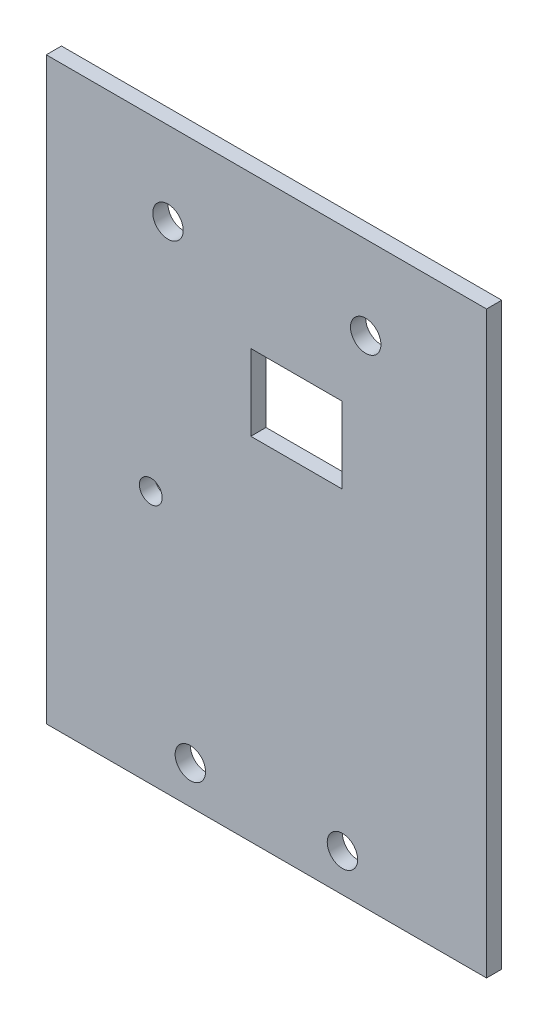
ISO-10303-21;
HEADER;
FILE_DESCRIPTION(('STEP AP214'),'2;1');
FILE_NAME('part.step','',(''),(''),'','','');
FILE_SCHEMA(('AUTOMOTIVE_DESIGN { 1 0 10303 214 1 1 1 1 }'));
ENDSEC;
DATA;
#1=APPLICATION_CONTEXT('core data for automotive mechanical design processes');
#2=APPLICATION_PROTOCOL_DEFINITION('international standard','automotive_design',2000,#1);
#3=PRODUCT_CONTEXT('',#1,'mechanical');
#4=PRODUCT('Part','Part','',(#3));
#5=PRODUCT_RELATED_PRODUCT_CATEGORY('part','',(#4));
#6=PRODUCT_DEFINITION_FORMATION('','',#4);
#7=PRODUCT_DEFINITION_CONTEXT('part definition',#1,'design');
#8=PRODUCT_DEFINITION('design','',#6,#7);
#9=PRODUCT_DEFINITION_SHAPE('','',#8);
#10=(LENGTH_UNIT() NAMED_UNIT(*) SI_UNIT(.MILLI.,.METRE.));
#11=(NAMED_UNIT(*) PLANE_ANGLE_UNIT() SI_UNIT($,.RADIAN.));
#12=(NAMED_UNIT(*) SI_UNIT($,.STERADIAN.) SOLID_ANGLE_UNIT());
#13=UNCERTAINTY_MEASURE_WITH_UNIT(LENGTH_MEASURE(1.E-05),#10,'distance_accuracy_value','');
#14=(GEOMETRIC_REPRESENTATION_CONTEXT(3) GLOBAL_UNCERTAINTY_ASSIGNED_CONTEXT((#13)) GLOBAL_UNIT_ASSIGNED_CONTEXT((#10,
#11,#12)) REPRESENTATION_CONTEXT('',''));
#15=CARTESIAN_POINT('',(0.,0.,0.));
#16=DIRECTION('',(0.,0.,1.));
#17=DIRECTION('',(1.,0.,0.));
#18=AXIS2_PLACEMENT_3D('',#15,#16,#17);
#19=CARTESIAN_POINT('',(-35.5403922344283,29.2034183120229,2.));
#20=DIRECTION('',(1.,0.,0.));
#21=DIRECTION('',(0.,0.,-1.));
#22=AXIS2_PLACEMENT_3D('',#19,#20,#21);
#23=PLANE('',#22);
#24=DIRECTION('',(0.,-1.,0.));
#25=VECTOR('',#24,1.);
#26=CARTESIAN_POINT('',(-35.5403922344283,29.2034183120229,-8.));
#27=LINE('',#26,#25);
#28=CARTESIAN_POINT('',(-35.5403922344283,29.2034183120229,-8.));
#29=VERTEX_POINT('',#28);
#30=CARTESIAN_POINT('',(-35.5403922344283,-46.9965816879772,-8.));
#31=VERTEX_POINT('',#30);
#32=EDGE_CURVE('E114',#29,#31,#27,.T.);
#33=ORIENTED_EDGE('',*,*,#32,.F.);
#34=DIRECTION('',(0.,0.,-1.));
#35=VECTOR('',#34,1.);
#36=CARTESIAN_POINT('',(-35.5403922344283,29.2034183120229,2.));
#37=LINE('',#36,#35);
#38=CARTESIAN_POINT('',(-35.5403922344283,29.2034183120229,-10.));
#39=VERTEX_POINT('',#38);
#40=EDGE_CURVE('E133',#29,#39,#37,.T.);
#41=ORIENTED_EDGE('',*,*,#40,.T.);
#42=DIRECTION('',(0.,1.,0.));
#43=VECTOR('',#42,1.);
#44=CARTESIAN_POINT('',(-35.5403922344283,0.,-10.));
#45=LINE('',#44,#43);
#46=CARTESIAN_POINT('',(-35.5403922344283,-46.9965816879772,-10.));
#47=VERTEX_POINT('',#46);
#48=EDGE_CURVE('E131',#47,#39,#45,.T.);
#49=ORIENTED_EDGE('',*,*,#48,.F.);
#50=DIRECTION('',(0.,0.,-1.));
#51=VECTOR('',#50,1.);
#52=CARTESIAN_POINT('',(-35.5403922344283,-46.9965816879772,2.));
#53=LINE('',#52,#51);
#54=EDGE_CURVE('E12',#31,#47,#53,.T.);
#55=ORIENTED_EDGE('',*,*,#54,.F.);
#56=EDGE_LOOP('',(#33,#41,#49,#55));
#57=FACE_BOUND('',#56,.T.);
#58=ADVANCED_FACE('F52',(#57),#23,.F.);
#59=CARTESIAN_POINT('',(-35.5403922344283,-46.9965816879772,2.));
#60=DIRECTION('',(0.,1.,0.));
#61=DIRECTION('',(0.,0.,1.));
#62=AXIS2_PLACEMENT_3D('',#59,#60,#61);
#63=PLANE('',#62);
#64=DIRECTION('',(1.,0.,0.));
#65=VECTOR('',#64,1.);
#66=CARTESIAN_POINT('',(-35.5403922344283,-46.9965816879772,-8.));
#67=LINE('',#66,#65);
#68=CARTESIAN_POINT('',(22.3596077655717,-46.9965816879772,-8.));
#69=VERTEX_POINT('',#68);
#70=EDGE_CURVE('E118',#31,#69,#67,.T.);
#71=ORIENTED_EDGE('',*,*,#70,.F.);
#72=ORIENTED_EDGE('',*,*,#54,.T.);
#73=DIRECTION('',(-1.,0.,0.));
#74=VECTOR('',#73,1.);
#75=CARTESIAN_POINT('',(0.,-46.9965816879772,-10.));
#76=LINE('',#75,#74);
#77=CARTESIAN_POINT('',(22.3596077655717,-46.9965816879772,-10.));
#78=VERTEX_POINT('',#77);
#79=EDGE_CURVE('E138',#78,#47,#76,.T.);
#80=ORIENTED_EDGE('',*,*,#79,.F.);
#81=DIRECTION('',(0.,0.,-1.));
#82=VECTOR('',#81,1.);
#83=CARTESIAN_POINT('',(22.3596077655717,-46.9965816879772,2.));
#84=LINE('',#83,#82);
#85=EDGE_CURVE('E60',#69,#78,#84,.T.);
#86=ORIENTED_EDGE('',*,*,#85,.F.);
#87=EDGE_LOOP('',(#71,#72,#80,#86));
#88=FACE_BOUND('',#87,.T.);
#89=ADVANCED_FACE('F126',(#88),#63,.F.);
#90=CARTESIAN_POINT('',(22.3596077655717,29.2034183120229,2.));
#91=DIRECTION('',(-1.,0.,0.));
#92=DIRECTION('',(0.,-1.,0.));
#93=AXIS2_PLACEMENT_3D('',#90,#91,#92);
#94=PLANE('',#93);
#95=DIRECTION('',(0.,1.,0.));
#96=VECTOR('',#95,1.);
#97=CARTESIAN_POINT('',(22.3596077655717,29.2034183120229,-8.));
#98=LINE('',#97,#96);
#99=CARTESIAN_POINT('',(22.3596077655717,29.2034183120229,-8.));
#100=VERTEX_POINT('',#99);
#101=EDGE_CURVE('E67',#69,#100,#98,.T.);
#102=ORIENTED_EDGE('',*,*,#101,.F.);
#103=ORIENTED_EDGE('',*,*,#85,.T.);
#104=DIRECTION('',(0.,-1.,0.));
#105=VECTOR('',#104,1.);
#106=CARTESIAN_POINT('',(22.3596077655717,0.,-10.));
#107=LINE('',#106,#105);
#108=CARTESIAN_POINT('',(22.3596077655717,29.2034183120229,-10.));
#109=VERTEX_POINT('',#108);
#110=EDGE_CURVE('E144',#109,#78,#107,.T.);
#111=ORIENTED_EDGE('',*,*,#110,.F.);
#112=DIRECTION('',(0.,0.,-1.));
#113=VECTOR('',#112,1.);
#114=CARTESIAN_POINT('',(22.3596077655717,29.2034183120229,2.));
#115=LINE('',#114,#113);
#116=EDGE_CURVE('E175',#100,#109,#115,.T.);
#117=ORIENTED_EDGE('',*,*,#116,.F.);
#118=EDGE_LOOP('',(#102,#103,#111,#117));
#119=FACE_BOUND('',#118,.T.);
#120=ADVANCED_FACE('F178',(#119),#94,.F.);
#121=CARTESIAN_POINT('',(-35.5403922344283,29.2034183120229,2.));
#122=DIRECTION('',(0.,-1.,0.));
#123=DIRECTION('',(0.,0.,-1.));
#124=AXIS2_PLACEMENT_3D('',#121,#122,#123);
#125=PLANE('',#124);
#126=DIRECTION('',(-1.,0.,0.));
#127=VECTOR('',#126,1.);
#128=CARTESIAN_POINT('',(-35.5403922344283,29.2034183120229,-8.));
#129=LINE('',#128,#127);
#130=EDGE_CURVE('E119',#100,#29,#129,.T.);
#131=ORIENTED_EDGE('',*,*,#130,.F.);
#132=ORIENTED_EDGE('',*,*,#116,.T.);
#133=DIRECTION('',(1.,0.,0.));
#134=VECTOR('',#133,1.);
#135=CARTESIAN_POINT('',(0.,29.2034183120229,-10.));
#136=LINE('',#135,#134);
#137=EDGE_CURVE('E137',#39,#109,#136,.T.);
#138=ORIENTED_EDGE('',*,*,#137,.F.);
#139=ORIENTED_EDGE('',*,*,#40,.F.);
#140=EDGE_LOOP('',(#131,#132,#138,#139));
#141=FACE_BOUND('',#140,.T.);
#142=ADVANCED_FACE('F232',(#141),#125,.F.);
#143=CARTESIAN_POINT('',(-16.5903922344283,-41.9965816879772,17.6204993518133));
#144=DIRECTION('',(0.,0.,-1.));
#145=DIRECTION('',(-1.,0.,0.));
#146=AXIS2_PLACEMENT_3D('',#143,#144,#145);
#147=CYLINDRICAL_SURFACE('',#146,2.);
#148=CARTESIAN_POINT('',(-16.5903922344283,-41.9965816879772,-10.));
#149=DIRECTION('',(0.,0.,-1.));
#150=DIRECTION('',(-1.,0.,0.));
#151=AXIS2_PLACEMENT_3D('',#148,#149,#150);
#152=CIRCLE('',#151,2.);
#153=CARTESIAN_POINT('',(-18.5903922344283,-41.9965816879772,-10.));
#154=VERTEX_POINT('',#153);
#155=EDGE_CURVE('E206',#154,#154,#152,.F.);
#156=ORIENTED_EDGE('',*,*,#155,.F.);
#157=EDGE_LOOP('',(#156));
#158=FACE_BOUND('',#157,.T.);
#159=CARTESIAN_POINT('',(-16.5903922344283,-41.9965816879772,-8.));
#160=DIRECTION('',(0.,0.,1.));
#161=DIRECTION('',(1.,0.,0.));
#162=AXIS2_PLACEMENT_3D('',#159,#160,#161);
#163=CIRCLE('',#162,2.);
#164=CARTESIAN_POINT('',(-14.5903922344283,-41.9965816879772,-8.));
#165=VERTEX_POINT('',#164);
#166=EDGE_CURVE('E199',#165,#165,#163,.F.);
#167=ORIENTED_EDGE('',*,*,#166,.F.);
#168=EDGE_LOOP('',(#167));
#169=FACE_BOUND('',#168,.T.);
#170=ADVANCED_FACE('F230',(#158,#169),#147,.F.);
#171=CARTESIAN_POINT('',(3.40960776557173,-41.9965816879772,17.6204993518133));
#172=DIRECTION('',(0.,0.,-1.));
#173=DIRECTION('',(-1.,0.,0.));
#174=AXIS2_PLACEMENT_3D('',#171,#172,#173);
#175=CYLINDRICAL_SURFACE('',#174,2.);
#176=CARTESIAN_POINT('',(3.40960776557173,-41.9965816879772,-10.));
#177=DIRECTION('',(0.,0.,-1.));
#178=DIRECTION('',(-1.,0.,0.));
#179=AXIS2_PLACEMENT_3D('',#176,#177,#178);
#180=CIRCLE('',#179,2.);
#181=CARTESIAN_POINT('',(1.40960776557173,-41.9965816879772,-10.));
#182=VERTEX_POINT('',#181);
#183=EDGE_CURVE('E145',#182,#182,#180,.F.);
#184=ORIENTED_EDGE('',*,*,#183,.F.);
#185=EDGE_LOOP('',(#184));
#186=FACE_BOUND('',#185,.T.);
#187=CARTESIAN_POINT('',(3.40960776557173,-41.9965816879772,-8.));
#188=DIRECTION('',(0.,0.,1.));
#189=DIRECTION('',(1.,0.,0.));
#190=AXIS2_PLACEMENT_3D('',#187,#188,#189);
#191=CIRCLE('',#190,2.);
#192=CARTESIAN_POINT('',(5.40960776557173,-41.9965816879772,-8.));
#193=VERTEX_POINT('',#192);
#194=EDGE_CURVE('E196',#193,#193,#191,.F.);
#195=ORIENTED_EDGE('',*,*,#194,.F.);
#196=EDGE_LOOP('',(#195));
#197=FACE_BOUND('',#196,.T.);
#198=ADVANCED_FACE('F219',(#186,#197),#175,.F.);
#199=CARTESIAN_POINT('',(-21.7903922344283,-13.6265816879771,17.6204993518133));
#200=DIRECTION('',(0.,0.,-1.));
#201=DIRECTION('',(-1.,0.,0.));
#202=AXIS2_PLACEMENT_3D('',#199,#200,#201);
#203=CYLINDRICAL_SURFACE('',#202,1.5);
#204=CARTESIAN_POINT('',(-21.7903922344283,-13.6265816879771,-10.));
#205=DIRECTION('',(0.,0.,-1.));
#206=DIRECTION('',(-1.,0.,0.));
#207=AXIS2_PLACEMENT_3D('',#204,#205,#206);
#208=CIRCLE('',#207,1.5);
#209=CARTESIAN_POINT('',(-23.2903922344283,-13.6265816879771,-10.));
#210=VERTEX_POINT('',#209);
#211=EDGE_CURVE('E148',#210,#210,#208,.F.);
#212=ORIENTED_EDGE('',*,*,#211,.F.);
#213=EDGE_LOOP('',(#212));
#214=FACE_BOUND('',#213,.T.);
#215=CARTESIAN_POINT('',(-21.7903922344283,-13.6265816879771,-8.));
#216=DIRECTION('',(0.,0.,1.));
#217=DIRECTION('',(1.,0.,0.));
#218=AXIS2_PLACEMENT_3D('',#215,#216,#217);
#219=CIRCLE('',#218,1.5);
#220=CARTESIAN_POINT('',(-20.2903922344283,-13.6265816879771,-8.));
#221=VERTEX_POINT('',#220);
#222=EDGE_CURVE('E193',#221,#221,#219,.F.);
#223=ORIENTED_EDGE('',*,*,#222,.F.);
#224=EDGE_LOOP('',(#223));
#225=FACE_BOUND('',#224,.T.);
#226=ADVANCED_FACE('F215',(#214,#225),#203,.F.);
#227=CARTESIAN_POINT('',(0.,-0.796581687977154,17.6204993518133));
#228=DIRECTION('',(0.,1.,0.));
#229=DIRECTION('',(0.,0.,1.));
#230=AXIS2_PLACEMENT_3D('',#227,#228,#229);
#231=PLANE('',#230);
#232=DIRECTION('',(0.,0.,-1.));
#233=VECTOR('',#232,1.);
#234=CARTESIAN_POINT('',(-8.64039223442828,-0.796581687977154,17.6204993518133));
#235=LINE('',#234,#233);
#236=CARTESIAN_POINT('',(-8.64039223442828,-0.796581687977154,-8.));
#237=VERTEX_POINT('',#236);
#238=CARTESIAN_POINT('',(-8.64039223442828,-0.796581687977154,-10.));
#239=VERTEX_POINT('',#238);
#240=EDGE_CURVE('E166',#237,#239,#235,.T.);
#241=ORIENTED_EDGE('',*,*,#240,.F.);
#242=DIRECTION('',(1.,0.,0.));
#243=VECTOR('',#242,1.);
#244=CARTESIAN_POINT('',(0.,-0.796581687977154,-8.));
#245=LINE('',#244,#243);
#246=CARTESIAN_POINT('',(3.35960776557172,-0.796581687977154,-8.));
#247=VERTEX_POINT('',#246);
#248=EDGE_CURVE('E75',#237,#247,#245,.T.);
#249=ORIENTED_EDGE('',*,*,#248,.T.);
#250=DIRECTION('',(0.,0.,-1.));
#251=VECTOR('',#250,1.);
#252=CARTESIAN_POINT('',(3.35960776557172,-0.796581687977154,17.6204993518133));
#253=LINE('',#252,#251);
#254=CARTESIAN_POINT('',(3.35960776557172,-0.796581687977154,-10.));
#255=VERTEX_POINT('',#254);
#256=EDGE_CURVE('E167',#247,#255,#253,.T.);
#257=ORIENTED_EDGE('',*,*,#256,.T.);
#258=DIRECTION('',(1.,0.,0.));
#259=VECTOR('',#258,1.);
#260=CARTESIAN_POINT('',(0.,-0.796581687977154,-10.));
#261=LINE('',#260,#259);
#262=EDGE_CURVE('E163',#239,#255,#261,.T.);
#263=ORIENTED_EDGE('',*,*,#262,.F.);
#264=EDGE_LOOP('',(#241,#249,#257,#263));
#265=FACE_BOUND('',#264,.T.);
#266=ADVANCED_FACE('F218',(#265),#231,.T.);
#267=CARTESIAN_POINT('',(3.35960776557172,0.,17.6204993518133));
#268=DIRECTION('',(1.,0.,0.));
#269=DIRECTION('',(0.,0.,-1.));
#270=AXIS2_PLACEMENT_3D('',#267,#268,#269);
#271=PLANE('',#270);
#272=DIRECTION('',(0.,-1.,0.));
#273=VECTOR('',#272,1.);
#274=CARTESIAN_POINT('',(3.35960776557172,0.,-8.));
#275=LINE('',#274,#273);
#276=CARTESIAN_POINT('',(3.35960776557172,9.20341831202285,-8.));
#277=VERTEX_POINT('',#276);
#278=EDGE_CURVE('E190',#277,#247,#275,.T.);
#279=ORIENTED_EDGE('',*,*,#278,.F.);
#280=DIRECTION('',(0.,0.,-1.));
#281=VECTOR('',#280,1.);
#282=CARTESIAN_POINT('',(3.35960776557172,9.20341831202285,17.6204993518133));
#283=LINE('',#282,#281);
#284=CARTESIAN_POINT('',(3.35960776557172,9.20341831202285,-10.));
#285=VERTEX_POINT('',#284);
#286=EDGE_CURVE('E169',#277,#285,#283,.T.);
#287=ORIENTED_EDGE('',*,*,#286,.T.);
#288=DIRECTION('',(0.,1.,0.));
#289=VECTOR('',#288,1.);
#290=CARTESIAN_POINT('',(3.35960776557172,0.,-10.));
#291=LINE('',#290,#289);
#292=EDGE_CURVE('E154',#255,#285,#291,.T.);
#293=ORIENTED_EDGE('',*,*,#292,.F.);
#294=ORIENTED_EDGE('',*,*,#256,.F.);
#295=EDGE_LOOP('',(#279,#287,#293,#294));
#296=FACE_BOUND('',#295,.T.);
#297=ADVANCED_FACE('F257',(#296),#271,.F.);
#298=CARTESIAN_POINT('',(0.,9.20341831202285,17.6204993518133));
#299=DIRECTION('',(0.,1.,0.));
#300=DIRECTION('',(0.,0.,1.));
#301=AXIS2_PLACEMENT_3D('',#298,#299,#300);
#302=PLANE('',#301);
#303=DIRECTION('',(1.,0.,0.));
#304=VECTOR('',#303,1.);
#305=CARTESIAN_POINT('',(0.,9.20341831202285,-8.));
#306=LINE('',#305,#304);
#307=CARTESIAN_POINT('',(-8.64039223442828,9.20341831202285,-8.));
#308=VERTEX_POINT('',#307);
#309=EDGE_CURVE('E188',#308,#277,#306,.T.);
#310=ORIENTED_EDGE('',*,*,#309,.F.);
#311=DIRECTION('',(0.,0.,-1.));
#312=VECTOR('',#311,1.);
#313=CARTESIAN_POINT('',(-8.64039223442828,9.20341831202285,17.6204993518133));
#314=LINE('',#313,#312);
#315=CARTESIAN_POINT('',(-8.64039223442828,9.20341831202285,-10.));
#316=VERTEX_POINT('',#315);
#317=EDGE_CURVE('E171',#308,#316,#314,.T.);
#318=ORIENTED_EDGE('',*,*,#317,.T.);
#319=DIRECTION('',(-1.,0.,0.));
#320=VECTOR('',#319,1.);
#321=CARTESIAN_POINT('',(0.,9.20341831202285,-10.));
#322=LINE('',#321,#320);
#323=EDGE_CURVE('E157',#285,#316,#322,.T.);
#324=ORIENTED_EDGE('',*,*,#323,.F.);
#325=ORIENTED_EDGE('',*,*,#286,.F.);
#326=EDGE_LOOP('',(#310,#318,#324,#325));
#327=FACE_BOUND('',#326,.T.);
#328=ADVANCED_FACE('F261',(#327),#302,.F.);
#329=CARTESIAN_POINT('',(-8.64039223442828,0.,17.6204993518133));
#330=DIRECTION('',(1.,0.,0.));
#331=DIRECTION('',(0.,0.,-1.));
#332=AXIS2_PLACEMENT_3D('',#329,#330,#331);
#333=PLANE('',#332);
#334=ORIENTED_EDGE('',*,*,#317,.F.);
#335=DIRECTION('',(0.,-1.,0.));
#336=VECTOR('',#335,1.);
#337=CARTESIAN_POINT('',(-8.64039223442828,0.,-8.));
#338=LINE('',#337,#336);
#339=EDGE_CURVE('E186',#308,#237,#338,.T.);
#340=ORIENTED_EDGE('',*,*,#339,.T.);
#341=ORIENTED_EDGE('',*,*,#240,.T.);
#342=DIRECTION('',(0.,-1.,0.));
#343=VECTOR('',#342,1.);
#344=CARTESIAN_POINT('',(-8.64039223442828,0.,-10.));
#345=LINE('',#344,#343);
#346=EDGE_CURVE('E160',#316,#239,#345,.T.);
#347=ORIENTED_EDGE('',*,*,#346,.F.);
#348=EDGE_LOOP('',(#334,#340,#341,#347));
#349=FACE_BOUND('',#348,.T.);
#350=ADVANCED_FACE('F264',(#349),#333,.T.);
#351=CARTESIAN_POINT('',(-19.5318449308341,18.2034183120228,0.));
#352=DIRECTION('',(0.,0.,-1.));
#353=DIRECTION('',(-1.,0.,0.));
#354=AXIS2_PLACEMENT_3D('',#351,#352,#353);
#355=CYLINDRICAL_SURFACE('',#354,2.);
#356=CARTESIAN_POINT('',(-19.5318449308341,18.2034183120228,-10.));
#357=DIRECTION('',(0.,0.,-1.));
#358=DIRECTION('',(-1.,0.,0.));
#359=AXIS2_PLACEMENT_3D('',#356,#357,#358);
#360=CIRCLE('',#359,2.);
#361=CARTESIAN_POINT('',(-21.5318449308341,18.2034183120228,-10.));
#362=VERTEX_POINT('',#361);
#363=EDGE_CURVE('E202',#362,#362,#360,.T.);
#364=ORIENTED_EDGE('',*,*,#363,.T.);
#365=EDGE_LOOP('',(#364));
#366=FACE_BOUND('',#365,.T.);
#367=CARTESIAN_POINT('',(-19.5318449308341,18.2034183120228,-8.));
#368=DIRECTION('',(0.,0.,1.));
#369=DIRECTION('',(1.,0.,0.));
#370=AXIS2_PLACEMENT_3D('',#367,#368,#369);
#371=CIRCLE('',#370,2.);
#372=CARTESIAN_POINT('',(-17.5318449308341,18.2034183120228,-8.));
#373=VERTEX_POINT('',#372);
#374=EDGE_CURVE('E183',#373,#373,#371,.F.);
#375=ORIENTED_EDGE('',*,*,#374,.F.);
#376=EDGE_LOOP('',(#375));
#377=FACE_BOUND('',#376,.T.);
#378=ADVANCED_FACE('F267',(#366,#377),#355,.F.);
#379=CARTESIAN_POINT('',(6.4681550691659,18.2034183120228,0.));
#380=DIRECTION('',(0.,0.,-1.));
#381=DIRECTION('',(-1.,0.,0.));
#382=AXIS2_PLACEMENT_3D('',#379,#380,#381);
#383=CYLINDRICAL_SURFACE('',#382,2.);
#384=CARTESIAN_POINT('',(6.4681550691659,18.2034183120228,-10.));
#385=DIRECTION('',(0.,0.,-1.));
#386=DIRECTION('',(-1.,0.,0.));
#387=AXIS2_PLACEMENT_3D('',#384,#385,#386);
#388=CIRCLE('',#387,2.);
#389=CARTESIAN_POINT('',(4.4681550691659,18.2034183120228,-10.));
#390=VERTEX_POINT('',#389);
#391=EDGE_CURVE('E203',#390,#390,#388,.T.);
#392=ORIENTED_EDGE('',*,*,#391,.T.);
#393=EDGE_LOOP('',(#392));
#394=FACE_BOUND('',#393,.T.);
#395=CARTESIAN_POINT('',(6.4681550691659,18.2034183120228,-8.));
#396=DIRECTION('',(0.,0.,1.));
#397=DIRECTION('',(1.,0.,0.));
#398=AXIS2_PLACEMENT_3D('',#395,#396,#397);
#399=CIRCLE('',#398,2.);
#400=CARTESIAN_POINT('',(8.4681550691659,18.2034183120228,-8.));
#401=VERTEX_POINT('',#400);
#402=EDGE_CURVE('E55',#401,#401,#399,.F.);
#403=ORIENTED_EDGE('',*,*,#402,.F.);
#404=EDGE_LOOP('',(#403));
#405=FACE_BOUND('',#404,.T.);
#406=ADVANCED_FACE('F272',(#394,#405),#383,.F.);
#407=CARTESIAN_POINT('',(0.,0.,-10.));
#408=DIRECTION('',(0.,0.,-1.));
#409=DIRECTION('',(-1.,0.,0.));
#410=AXIS2_PLACEMENT_3D('',#407,#408,#409);
#411=PLANE('',#410);
#412=ORIENTED_EDGE('',*,*,#391,.F.);
#413=EDGE_LOOP('',(#412));
#414=FACE_BOUND('',#413,.T.);
#415=ORIENTED_EDGE('',*,*,#363,.F.);
#416=EDGE_LOOP('',(#415));
#417=FACE_BOUND('',#416,.T.);
#418=ORIENTED_EDGE('',*,*,#155,.T.);
#419=EDGE_LOOP('',(#418));
#420=FACE_BOUND('',#419,.T.);
#421=ORIENTED_EDGE('',*,*,#211,.T.);
#422=EDGE_LOOP('',(#421));
#423=FACE_BOUND('',#422,.T.);
#424=ORIENTED_EDGE('',*,*,#183,.T.);
#425=EDGE_LOOP('',(#424));
#426=FACE_BOUND('',#425,.T.);
#427=ORIENTED_EDGE('',*,*,#79,.T.);
#428=ORIENTED_EDGE('',*,*,#48,.T.);
#429=ORIENTED_EDGE('',*,*,#137,.T.);
#430=ORIENTED_EDGE('',*,*,#110,.T.);
#431=EDGE_LOOP('',(#427,#428,#429,#430));
#432=FACE_BOUND('',#431,.T.);
#433=ORIENTED_EDGE('',*,*,#292,.T.);
#434=ORIENTED_EDGE('',*,*,#323,.T.);
#435=ORIENTED_EDGE('',*,*,#346,.T.);
#436=ORIENTED_EDGE('',*,*,#262,.T.);
#437=EDGE_LOOP('',(#433,#434,#435,#436));
#438=FACE_BOUND('',#437,.T.);
#439=ADVANCED_FACE('F141',(#414,#417,#420,#423,#426,#432,#438),#411,.T.);
#440=CARTESIAN_POINT('',(0.,0.,-8.));
#441=DIRECTION('',(0.,0.,1.));
#442=DIRECTION('',(1.,0.,0.));
#443=AXIS2_PLACEMENT_3D('',#440,#441,#442);
#444=PLANE('',#443);
#445=ORIENTED_EDGE('',*,*,#339,.F.);
#446=ORIENTED_EDGE('',*,*,#309,.T.);
#447=ORIENTED_EDGE('',*,*,#278,.T.);
#448=ORIENTED_EDGE('',*,*,#248,.F.);
#449=EDGE_LOOP('',(#445,#446,#447,#448));
#450=FACE_BOUND('',#449,.T.);
#451=ORIENTED_EDGE('',*,*,#32,.T.);
#452=ORIENTED_EDGE('',*,*,#70,.T.);
#453=ORIENTED_EDGE('',*,*,#101,.T.);
#454=ORIENTED_EDGE('',*,*,#130,.T.);
#455=EDGE_LOOP('',(#451,#452,#453,#454));
#456=FACE_BOUND('',#455,.T.);
#457=ORIENTED_EDGE('',*,*,#402,.T.);
#458=EDGE_LOOP('',(#457));
#459=FACE_BOUND('',#458,.T.);
#460=ORIENTED_EDGE('',*,*,#374,.T.);
#461=EDGE_LOOP('',(#460));
#462=FACE_BOUND('',#461,.T.);
#463=ORIENTED_EDGE('',*,*,#222,.T.);
#464=EDGE_LOOP('',(#463));
#465=FACE_BOUND('',#464,.T.);
#466=ORIENTED_EDGE('',*,*,#194,.T.);
#467=EDGE_LOOP('',(#466));
#468=FACE_BOUND('',#467,.T.);
#469=ORIENTED_EDGE('',*,*,#166,.T.);
#470=EDGE_LOOP('',(#469));
#471=FACE_BOUND('',#470,.T.);
#472=ADVANCED_FACE('F116',(#450,#456,#459,#462,#465,#468,#471),#444,.T.);
#473=CLOSED_SHELL('',(#58,#89,#120,#142,#170,#198,#226,#266,#297,#328,#350,#378,#406,#439,#472));
#474=MANIFOLD_SOLID_BREP('B2',#473);
#475=ADVANCED_BREP_SHAPE_REPRESENTATION('',(#18,#474),#14);
#476=SHAPE_DEFINITION_REPRESENTATION(#9,#475);
ENDSEC;
END-ISO-10303-21;
